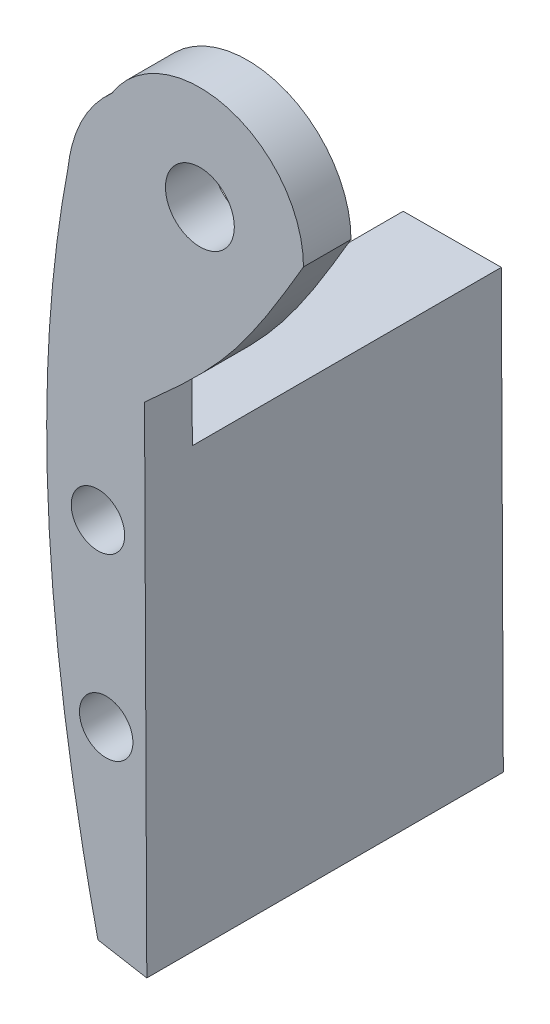
ISO-10303-21;
HEADER;
FILE_DESCRIPTION(('STEP AP214'),'2;1');
FILE_NAME('part.step','',(''),(''),'','','');
FILE_SCHEMA(('AUTOMOTIVE_DESIGN { 1 0 10303 214 1 1 1 1 }'));
ENDSEC;
DATA;
#1=APPLICATION_CONTEXT('core data for automotive mechanical design processes');
#2=APPLICATION_PROTOCOL_DEFINITION('international standard','automotive_design',2000,#1);
#3=PRODUCT_CONTEXT('',#1,'mechanical');
#4=PRODUCT('Part','Part','',(#3));
#5=PRODUCT_RELATED_PRODUCT_CATEGORY('part','',(#4));
#6=PRODUCT_DEFINITION_FORMATION('','',#4);
#7=PRODUCT_DEFINITION_CONTEXT('part definition',#1,'design');
#8=PRODUCT_DEFINITION('design','',#6,#7);
#9=PRODUCT_DEFINITION_SHAPE('','',#8);
#10=(LENGTH_UNIT() NAMED_UNIT(*) SI_UNIT(.MILLI.,.METRE.));
#11=(NAMED_UNIT(*) PLANE_ANGLE_UNIT() SI_UNIT($,.RADIAN.));
#12=(NAMED_UNIT(*) SI_UNIT($,.STERADIAN.) SOLID_ANGLE_UNIT());
#13=UNCERTAINTY_MEASURE_WITH_UNIT(LENGTH_MEASURE(1.E-05),#10,'distance_accuracy_value','');
#14=(GEOMETRIC_REPRESENTATION_CONTEXT(3) GLOBAL_UNCERTAINTY_ASSIGNED_CONTEXT((#13)) GLOBAL_UNIT_ASSIGNED_CONTEXT((#10,
#11,#12)) REPRESENTATION_CONTEXT('',''));
#15=CARTESIAN_POINT('',(0.,0.,0.));
#16=DIRECTION('',(0.,0.,1.));
#17=DIRECTION('',(1.,0.,0.));
#18=AXIS2_PLACEMENT_3D('',#15,#16,#17);
#19=CARTESIAN_POINT('',(-16.6639162338456,-14.6308064254302,-4.));
#20=CARTESIAN_POINT('',(-17.667702323107,-19.8812510451323,-4.));
#21=CARTESIAN_POINT('',(-18.2201315631726,-25.1890374929657,-4.));
#22=CARTESIAN_POINT('',(-18.4013115985762,-30.5145625315888,-4.));
#23=B_SPLINE_CURVE_WITH_KNOTS('',3,(#19,#20,#21,#22),.UNSPECIFIED.,.F.,.F.,(4,4),(0.,
0.288118642181765),.UNSPECIFIED.);
#24=DIRECTION('',(0.,0.,1.));
#25=VECTOR('',#24,1.);
#26=SURFACE_OF_LINEAR_EXTRUSION('',#23,#25);
#27=CARTESIAN_POINT('',(-18.4013115985762,-30.5145625315888,0.));
#28=CARTESIAN_POINT('',(-18.2201315631726,-25.1890374929657,0.));
#29=CARTESIAN_POINT('',(-17.667702323107,-19.8812510451323,0.));
#30=CARTESIAN_POINT('',(-16.6639162338456,-14.6308064254302,0.));
#31=B_SPLINE_CURVE_WITH_KNOTS('',3,(#27,#28,#29,#30),.UNSPECIFIED.,.F.,.F.,(4,4),(0.,
0.288118642181765),.UNSPECIFIED.);
#32=CARTESIAN_POINT('',(-16.6639162338456,-14.6308064254302,0.));
#33=VERTEX_POINT('',#32);
#34=CARTESIAN_POINT('',(-18.4013115985762,-30.5145625315887,0.));
#35=VERTEX_POINT('',#34);
#36=EDGE_CURVE('E181',#33,#35,#31,.F.);
#37=ORIENTED_EDGE('',*,*,#36,.F.);
#38=DIRECTION('',(0.,0.,1.));
#39=VECTOR('',#38,1.);
#40=CARTESIAN_POINT('',(-16.6639162338456,-14.6308064254302,-4.));
#41=LINE('',#40,#39);
#42=CARTESIAN_POINT('',(-16.6639162338456,-14.6308064254302,-4.));
#43=VERTEX_POINT('',#42);
#44=EDGE_CURVE('E11',#43,#33,#41,.T.);
#45=ORIENTED_EDGE('',*,*,#44,.F.);
#46=CARTESIAN_POINT('',(-16.6639162338456,-14.6308064254302,-4.));
#47=CARTESIAN_POINT('',(-17.667702323107,-19.8812510451323,-4.));
#48=CARTESIAN_POINT('',(-18.2201315631726,-25.1890374929657,-4.));
#49=CARTESIAN_POINT('',(-18.4013115985762,-30.5145625315888,-4.));
#50=B_SPLINE_CURVE_WITH_KNOTS('',3,(#46,#47,#48,#49),.UNSPECIFIED.,.F.,.F.,(4,4),(0.,
0.288118642181765),.UNSPECIFIED.);
#51=CARTESIAN_POINT('',(-18.4013115985762,-30.5145625315887,-4.));
#52=VERTEX_POINT('',#51);
#53=EDGE_CURVE('E173',#43,#52,#50,.T.);
#54=ORIENTED_EDGE('',*,*,#53,.T.);
#55=DIRECTION('',(0.,0.,1.));
#56=VECTOR('',#55,1.);
#57=CARTESIAN_POINT('',(-18.4013115985762,-30.5145625315887,-4.));
#58=LINE('',#57,#56);
#59=EDGE_CURVE('E101',#52,#35,#58,.T.);
#60=ORIENTED_EDGE('',*,*,#59,.T.);
#61=EDGE_LOOP('',(#37,#45,#54,#60));
#62=FACE_BOUND('',#61,.T.);
#63=ADVANCED_FACE('F41',(#62),#26,.T.);
#64=CARTESIAN_POINT('',(-12.9861837221063,-7.40648895480318,-4.));
#65=CARTESIAN_POINT('',(-16.1577958352121,-10.2367637695111,-4.));
#66=CARTESIAN_POINT('',(-16.6639162338456,-14.6308064254302,-4.));
#67=B_SPLINE_CURVE_WITH_KNOTS('',2,(#64,#65,#66),.UNSPECIFIED.,.F.,.F.,(3,3),(0.,1.),.UNSPECIFIED.);
#68=DIRECTION('',(0.,0.,1.));
#69=VECTOR('',#68,1.);
#70=SURFACE_OF_LINEAR_EXTRUSION('',#67,#69);
#71=CARTESIAN_POINT('',(-12.9861837221063,-7.40648895480318,0.));
#72=CARTESIAN_POINT('',(-16.1577958352121,-10.2367637695111,0.));
#73=CARTESIAN_POINT('',(-16.6639162338456,-14.6308064254302,0.));
#74=B_SPLINE_CURVE_WITH_KNOTS('',2,(#71,#72,#73),.UNSPECIFIED.,.F.,.F.,(3,3),(0.,1.),.UNSPECIFIED.);
#75=CARTESIAN_POINT('',(-12.9861837221063,-7.40648895480318,0.));
#76=VERTEX_POINT('',#75);
#77=EDGE_CURVE('E295',#76,#33,#74,.T.);
#78=ORIENTED_EDGE('',*,*,#77,.F.);
#79=DIRECTION('',(0.,0.,1.));
#80=VECTOR('',#79,1.);
#81=CARTESIAN_POINT('',(-12.9861837221063,-7.40648895480318,-4.));
#82=LINE('',#81,#80);
#83=CARTESIAN_POINT('',(-12.9861837221063,-7.40648895480318,-4.));
#84=VERTEX_POINT('',#83);
#85=EDGE_CURVE('E51',#84,#76,#82,.T.);
#86=ORIENTED_EDGE('',*,*,#85,.F.);
#87=EDGE_CURVE('E128',#84,#43,#67,.T.);
#88=ORIENTED_EDGE('',*,*,#87,.T.);
#89=ORIENTED_EDGE('',*,*,#44,.T.);
#90=EDGE_LOOP('',(#78,#86,#88,#89));
#91=FACE_BOUND('',#90,.T.);
#92=ADVANCED_FACE('F200',(#91),#70,.T.);
#93=CARTESIAN_POINT('',(-5.57162803204002,-11.9999999999996,-4.));
#94=DIRECTION('',(0.,0.,1.));
#95=DIRECTION('',(1.,0.,0.));
#96=AXIS2_PLACEMENT_3D('',#93,#94,#95);
#97=CYLINDRICAL_SURFACE('',#96,8.722154539071);
#98=CARTESIAN_POINT('',(-5.57162803204002,-11.9999999999996,0.));
#99=DIRECTION('',(0.,0.,1.));
#100=DIRECTION('',(1.,0.,0.));
#101=AXIS2_PLACEMENT_3D('',#98,#99,#100);
#102=CIRCLE('',#101,8.722154539071);
#103=CARTESIAN_POINT('',(3.15052650703097,-11.9999999999996,0.));
#104=VERTEX_POINT('',#103);
#105=EDGE_CURVE('E117',#104,#76,#102,.T.);
#106=ORIENTED_EDGE('',*,*,#105,.F.);
#107=DIRECTION('',(0.,0.,1.));
#108=VECTOR('',#107,1.);
#109=CARTESIAN_POINT('',(3.15052650703097,-11.9999999999996,-4.));
#110=LINE('',#109,#108);
#111=CARTESIAN_POINT('',(3.15052650703097,-11.9999999999996,-4.));
#112=VERTEX_POINT('',#111);
#113=EDGE_CURVE('E111',#112,#104,#110,.T.);
#114=ORIENTED_EDGE('',*,*,#113,.F.);
#115=CARTESIAN_POINT('',(-5.57162803204002,-11.9999999999996,-4.));
#116=DIRECTION('',(0.,0.,1.));
#117=DIRECTION('',(1.,0.,0.));
#118=AXIS2_PLACEMENT_3D('',#115,#116,#117);
#119=CIRCLE('',#118,8.722154539071);
#120=EDGE_CURVE('E114',#112,#84,#119,.T.);
#121=ORIENTED_EDGE('',*,*,#120,.T.);
#122=ORIENTED_EDGE('',*,*,#85,.T.);
#123=EDGE_LOOP('',(#106,#114,#121,#122));
#124=FACE_BOUND('',#123,.T.);
#125=ADVANCED_FACE('F113',(#124),#97,.T.);
#126=CARTESIAN_POINT('',(-10.2316008179203,-28.548135162408,-4.));
#127=CARTESIAN_POINT('',(-7.86437332426008,-26.4272964203006,-4.));
#128=CARTESIAN_POINT('',(-2.52235469825568,-21.6412925007652,-4.));
#129=CARTESIAN_POINT('',(1.12142674466251,-15.4485376326927,-4.));
#130=CARTESIAN_POINT('',(3.15052650703097,-11.9999999999996,-4.));
#131=B_SPLINE_CURVE_WITH_KNOTS('',3,(#126,#127,#128,#129,#130),.UNSPECIFIED.,.F.,.F.,(4,1,4),
(0.,0.443133515509802,1.),.UNSPECIFIED.);
#132=DIRECTION('',(0.,0.,1.));
#133=VECTOR('',#132,1.);
#134=SURFACE_OF_LINEAR_EXTRUSION('',#131,#133);
#135=CARTESIAN_POINT('',(-10.2316008179203,-28.548135162408,0.));
#136=CARTESIAN_POINT('',(-7.86437332426008,-26.4272964203006,0.));
#137=CARTESIAN_POINT('',(-2.52235469825568,-21.6412925007652,0.));
#138=CARTESIAN_POINT('',(1.12142674466251,-15.4485376326927,0.));
#139=CARTESIAN_POINT('',(3.15052650703097,-11.9999999999996,0.));
#140=B_SPLINE_CURVE_WITH_KNOTS('',3,(#135,#136,#137,#138,#139),.UNSPECIFIED.,.F.,.F.,(4,1,4),
(0.,0.443133515509802,1.),.UNSPECIFIED.);
#141=CARTESIAN_POINT('',(-10.2316008179203,-28.548135162408,0.));
#142=VERTEX_POINT('',#141);
#143=EDGE_CURVE('E297',#142,#104,#140,.T.);
#144=ORIENTED_EDGE('',*,*,#143,.F.);
#145=DIRECTION('',(0.,0.,1.));
#146=VECTOR('',#145,1.);
#147=CARTESIAN_POINT('',(-10.2316008179203,-28.548135162408,-4.));
#148=LINE('',#147,#146);
#149=CARTESIAN_POINT('',(-10.2316008179203,-28.548135162408,-4.));
#150=VERTEX_POINT('',#149);
#151=EDGE_CURVE('E122',#150,#142,#148,.T.);
#152=ORIENTED_EDGE('',*,*,#151,.F.);
#153=EDGE_CURVE('E127',#150,#112,#131,.T.);
#154=ORIENTED_EDGE('',*,*,#153,.T.);
#155=ORIENTED_EDGE('',*,*,#113,.T.);
#156=EDGE_LOOP('',(#144,#152,#154,#155));
#157=FACE_BOUND('',#156,.T.);
#158=ADVANCED_FACE('F131',(#157),#134,.T.);
#159=CARTESIAN_POINT('',(-10.0398414787974,-70.4384276849433,-4.));
#160=DIRECTION('',(0.999989522698505,0.00457760780494255,0.));
#161=DIRECTION('',(-0.00457760780494255,0.999989522698505,0.));
#162=AXIS2_PLACEMENT_3D('',#159,#160,#161);
#163=PLANE('',#162);
#164=DIRECTION('',(-0.00457760780494255,0.999989522698505,0.));
#165=VECTOR('',#164,1.);
#166=CARTESIAN_POINT('',(-10.0398414787974,-70.4384276849433,0.));
#167=LINE('',#166,#165);
#168=CARTESIAN_POINT('',(-10.0398414787974,-70.4384276849433,0.));
#169=VERTEX_POINT('',#168);
#170=EDGE_CURVE('E309',#169,#142,#167,.T.);
#171=ORIENTED_EDGE('',*,*,#170,.F.);
#172=DIRECTION('',(0.,0.,1.));
#173=VECTOR('',#172,1.);
#174=CARTESIAN_POINT('',(-10.0398414787974,-70.4384276849433,-4.));
#175=LINE('',#174,#173);
#176=CARTESIAN_POINT('',(-10.0398414787974,-70.4384276849433,-30.012432));
#177=VERTEX_POINT('',#176);
#178=EDGE_CURVE('E216',#177,#169,#175,.T.);
#179=ORIENTED_EDGE('',*,*,#178,.F.);
#180=DIRECTION('',(0.00457760780494154,-0.999989522698505,0.));
#181=VECTOR('',#180,1.);
#182=CARTESIAN_POINT('',(-10.2079392060906,-33.7170716305494,-30.012432));
#183=LINE('',#182,#181);
#184=CARTESIAN_POINT('',(-10.2079392060906,-33.7170716305494,-30.012432));
#185=VERTEX_POINT('',#184);
#186=EDGE_CURVE('E253',#185,#177,#183,.T.);
#187=ORIENTED_EDGE('',*,*,#186,.F.);
#188=DIRECTION('',(0.,0.,1.));
#189=VECTOR('',#188,1.);
#190=CARTESIAN_POINT('',(-10.2079392060906,-33.7170716305494,-30.012432));
#191=LINE('',#190,#189);
#192=CARTESIAN_POINT('',(-10.2079392060906,-33.7170716305494,-4.));
#193=VERTEX_POINT('',#192);
#194=EDGE_CURVE('E251',#185,#193,#191,.T.);
#195=ORIENTED_EDGE('',*,*,#194,.T.);
#196=DIRECTION('',(-0.00457760780494255,0.999989522698505,0.));
#197=VECTOR('',#196,1.);
#198=CARTESIAN_POINT('',(-10.0398414787974,-70.4384276849433,-4.));
#199=LINE('',#198,#197);
#200=EDGE_CURVE('E132',#193,#150,#199,.T.);
#201=ORIENTED_EDGE('',*,*,#200,.T.);
#202=ORIENTED_EDGE('',*,*,#151,.T.);
#203=EDGE_LOOP('',(#171,#179,#187,#195,#201,#202));
#204=FACE_BOUND('',#203,.T.);
#205=ADVANCED_FACE('F148',(#204),#163,.T.);
#206=CARTESIAN_POINT('',(-14.1533851889596,-69.7168711338995,-4.));
#207=DIRECTION('',(-0.172772117417386,-0.98496182435824,0.));
#208=DIRECTION('',(0.98496182435824,-0.172772117417386,0.));
#209=AXIS2_PLACEMENT_3D('',#206,#207,#208);
#210=PLANE('',#209);
#211=DIRECTION('',(0.98496182435824,-0.172772117417386,0.));
#212=VECTOR('',#211,1.);
#213=CARTESIAN_POINT('',(-14.1533851889596,-69.7168711338995,0.));
#214=LINE('',#213,#212);
#215=CARTESIAN_POINT('',(-14.1533851889596,-69.7168711338994,0.));
#216=VERTEX_POINT('',#215);
#217=EDGE_CURVE('E206',#216,#169,#214,.T.);
#218=ORIENTED_EDGE('',*,*,#217,.F.);
#219=DIRECTION('',(0.,0.,1.));
#220=VECTOR('',#219,1.);
#221=CARTESIAN_POINT('',(-14.1533851889596,-69.7168711338994,-4.));
#222=LINE('',#221,#220);
#223=CARTESIAN_POINT('',(-14.1533851889596,-69.7168711338994,-30.012432));
#224=VERTEX_POINT('',#223);
#225=EDGE_CURVE('E215',#224,#216,#222,.T.);
#226=ORIENTED_EDGE('',*,*,#225,.F.);
#227=DIRECTION('',(-0.984961824358234,0.172772117417422,0.));
#228=VECTOR('',#227,1.);
#229=CARTESIAN_POINT('',(-10.0398414787974,-70.4384276849433,-30.012432));
#230=LINE('',#229,#228);
#231=EDGE_CURVE('E250',#177,#224,#230,.T.);
#232=ORIENTED_EDGE('',*,*,#231,.F.);
#233=ORIENTED_EDGE('',*,*,#178,.T.);
#234=EDGE_LOOP('',(#218,#226,#232,#233));
#235=FACE_BOUND('',#234,.T.);
#236=ADVANCED_FACE('F152',(#235),#210,.T.);
#237=CARTESIAN_POINT('',(-18.4013115985762,-30.5145625315887,-4.));
#238=CARTESIAN_POINT('',(-18.8489698571187,-43.6728294416428,-4.));
#239=CARTESIAN_POINT('',(-17.030220330295,-56.9393871702691,-4.));
#240=CARTESIAN_POINT('',(-14.1533851889596,-69.7168711338994,-4.));
#241=B_SPLINE_CURVE_WITH_KNOTS('',3,(#237,#238,#239,#240),.UNSPECIFIED.,.F.,.F.,(4,4),
(0.288118642181765,1.),.UNSPECIFIED.);
#242=DIRECTION('',(0.,0.,1.));
#243=VECTOR('',#242,1.);
#244=SURFACE_OF_LINEAR_EXTRUSION('',#241,#243);
#245=CARTESIAN_POINT('',(-18.4013115985762,-30.5145625315887,0.));
#246=CARTESIAN_POINT('',(-18.8489698571187,-43.6728294416428,0.));
#247=CARTESIAN_POINT('',(-17.030220330295,-56.9393871702691,0.));
#248=CARTESIAN_POINT('',(-14.1533851889596,-69.7168711338994,0.));
#249=B_SPLINE_CURVE_WITH_KNOTS('',3,(#245,#246,#247,#248),.UNSPECIFIED.,.F.,.F.,(4,4),
(0.288118642181765,1.),.UNSPECIFIED.);
#250=EDGE_CURVE('E294',#35,#216,#249,.T.);
#251=ORIENTED_EDGE('',*,*,#250,.F.);
#252=ORIENTED_EDGE('',*,*,#59,.F.);
#253=CARTESIAN_POINT('',(-18.4663935069069,-33.7548759910607,-4.));
#254=VERTEX_POINT('',#253);
#255=EDGE_CURVE('E134',#52,#254,#241,.T.);
#256=ORIENTED_EDGE('',*,*,#255,.T.);
#257=DIRECTION('',(0.,0.,1.));
#258=VECTOR('',#257,1.);
#259=CARTESIAN_POINT('',(-18.4663935069097,-33.7548759915013,-17.006216));
#260=LINE('',#259,#258);
#261=CARTESIAN_POINT('',(-18.4663935069097,-33.7548759915013,-30.012432));
#262=VERTEX_POINT('',#261);
#263=EDGE_CURVE('E242',#262,#254,#260,.T.);
#264=ORIENTED_EDGE('',*,*,#263,.F.);
#265=CARTESIAN_POINT('',(-18.4663935069097,-33.7548759915013,-30.012432));
#266=CARTESIAN_POINT('',(-18.5434333171569,-45.8462770612342,-30.012432));
#267=CARTESIAN_POINT('',(-16.7942088460879,-57.9876338742109,-30.012432));
#268=CARTESIAN_POINT('',(-14.1533851889596,-69.7168711338994,-30.012432));
#269=B_SPLINE_CURVE_WITH_KNOTS('',3,(#265,#266,#267,#268),.UNSPECIFIED.,.F.,.F.,(4,4),
(0.346520381448641,1.),.UNSPECIFIED.);
#270=EDGE_CURVE('E233',#224,#262,#269,.F.);
#271=ORIENTED_EDGE('',*,*,#270,.F.);
#272=ORIENTED_EDGE('',*,*,#225,.T.);
#273=EDGE_LOOP('',(#251,#252,#256,#264,#271,#272));
#274=FACE_BOUND('',#273,.T.);
#275=ADVANCED_FACE('F155',(#274),#244,.T.);
#276=CARTESIAN_POINT('',(-17.8410911864076,-22.5445293214141,-4.));
#277=DIRECTION('',(0.,0.,-1.));
#278=DIRECTION('',(-1.,0.,0.));
#279=AXIS2_PLACEMENT_3D('',#276,#277,#278);
#280=PLANE('',#279);
#281=DIRECTION('',(0.999989522698505,0.00457760780494379,0.));
#282=VECTOR('',#281,1.);
#283=CARTESIAN_POINT('',(-10.2079392060906,-33.7170716305494,-4.));
#284=LINE('',#283,#282);
#285=EDGE_CURVE('E59',#254,#193,#284,.T.);
#286=ORIENTED_EDGE('',*,*,#285,.F.);
#287=ORIENTED_EDGE('',*,*,#255,.F.);
#288=ORIENTED_EDGE('',*,*,#53,.F.);
#289=ORIENTED_EDGE('',*,*,#87,.F.);
#290=ORIENTED_EDGE('',*,*,#120,.F.);
#291=ORIENTED_EDGE('',*,*,#153,.F.);
#292=ORIENTED_EDGE('',*,*,#200,.F.);
#293=EDGE_LOOP('',(#286,#287,#288,#289,#290,#291,#292));
#294=FACE_BOUND('',#293,.T.);
#295=CARTESIAN_POINT('',(-5.57162803204002,-11.9999999999996,-4.));
#296=DIRECTION('',(0.,0.,1.));
#297=DIRECTION('',(1.,0.,0.));
#298=AXIS2_PLACEMENT_3D('',#295,#296,#297);
#299=CIRCLE('',#298,2.9);
#300=CARTESIAN_POINT('',(-2.67162803204002,-11.9999999999996,-4.));
#301=VERTEX_POINT('',#300);
#302=EDGE_CURVE('E275',#301,#301,#299,.T.);
#303=ORIENTED_EDGE('',*,*,#302,.T.);
#304=EDGE_LOOP('',(#303));
#305=FACE_BOUND('',#304,.T.);
#306=ADVANCED_FACE('F125',(#294,#305),#280,.T.);
#307=CARTESIAN_POINT('',(-17.8410911864076,-22.5445293214141,0.));
#308=DIRECTION('',(0.,0.,-1.));
#309=DIRECTION('',(-1.,0.,0.));
#310=AXIS2_PLACEMENT_3D('',#307,#308,#309);
#311=PLANE('',#310);
#312=CARTESIAN_POINT('',(-13.4596618619648,-53.8503120663386,0.));
#313=DIRECTION('',(0.,0.,1.));
#314=DIRECTION('',(1.,0.,0.));
#315=AXIS2_PLACEMENT_3D('',#312,#313,#314);
#316=CIRCLE('',#315,2.25);
#317=CARTESIAN_POINT('',(-11.2096618619648,-53.8503120663386,0.));
#318=VERTEX_POINT('',#317);
#319=EDGE_CURVE('E355',#318,#318,#316,.T.);
#320=ORIENTED_EDGE('',*,*,#319,.F.);
#321=EDGE_LOOP('',(#320));
#322=FACE_BOUND('',#321,.T.);
#323=CARTESIAN_POINT('',(-14.1521539456759,-39.1038161764318,0.));
#324=DIRECTION('',(0.,0.,1.));
#325=DIRECTION('',(1.,0.,0.));
#326=AXIS2_PLACEMENT_3D('',#323,#324,#325);
#327=CIRCLE('',#326,2.25);
#328=CARTESIAN_POINT('',(-11.9021539456759,-39.1038161764318,0.));
#329=VERTEX_POINT('',#328);
#330=EDGE_CURVE('E352',#329,#329,#327,.T.);
#331=ORIENTED_EDGE('',*,*,#330,.F.);
#332=EDGE_LOOP('',(#331));
#333=FACE_BOUND('',#332,.T.);
#334=CARTESIAN_POINT('',(-5.57162803204002,-11.9999999999996,0.));
#335=DIRECTION('',(0.,0.,1.));
#336=DIRECTION('',(1.,0.,0.));
#337=AXIS2_PLACEMENT_3D('',#334,#335,#336);
#338=CIRCLE('',#337,2.9);
#339=CARTESIAN_POINT('',(-2.67162803204002,-11.9999999999996,0.));
#340=VERTEX_POINT('',#339);
#341=EDGE_CURVE('E266',#340,#340,#338,.T.);
#342=ORIENTED_EDGE('',*,*,#341,.F.);
#343=EDGE_LOOP('',(#342));
#344=FACE_BOUND('',#343,.T.);
#345=ORIENTED_EDGE('',*,*,#36,.T.);
#346=ORIENTED_EDGE('',*,*,#250,.T.);
#347=ORIENTED_EDGE('',*,*,#217,.T.);
#348=ORIENTED_EDGE('',*,*,#170,.T.);
#349=ORIENTED_EDGE('',*,*,#143,.T.);
#350=ORIENTED_EDGE('',*,*,#105,.T.);
#351=ORIENTED_EDGE('',*,*,#77,.T.);
#352=EDGE_LOOP('',(#345,#346,#347,#348,#349,#350,#351));
#353=FACE_BOUND('',#352,.T.);
#354=ADVANCED_FACE('F187',(#322,#333,#344,#353),#311,.F.);
#355=CARTESIAN_POINT('',(-5.57162803204002,-11.9999999999996,-4.));
#356=DIRECTION('',(0.,0.,1.));
#357=DIRECTION('',(1.,0.,0.));
#358=AXIS2_PLACEMENT_3D('',#355,#356,#357);
#359=CYLINDRICAL_SURFACE('',#358,2.9);
#360=ORIENTED_EDGE('',*,*,#302,.F.);
#361=EDGE_LOOP('',(#360));
#362=FACE_BOUND('',#361,.T.);
#363=ORIENTED_EDGE('',*,*,#341,.T.);
#364=EDGE_LOOP('',(#363));
#365=FACE_BOUND('',#364,.T.);
#366=ADVANCED_FACE('F196',(#362,#365),#359,.F.);
#367=CARTESIAN_POINT('',(-17.3290881482005,-51.8716849914672,-30.012432));
#368=DIRECTION('',(0.,0.,1.));
#369=DIRECTION('',(1.,0.,0.));
#370=AXIS2_PLACEMENT_3D('',#367,#368,#369);
#371=PLANE('',#370);
#372=CARTESIAN_POINT('',(-13.4596618619648,-53.8503120663386,-30.012432));
#373=DIRECTION('',(0.,0.,1.));
#374=DIRECTION('',(1.,0.,0.));
#375=AXIS2_PLACEMENT_3D('',#372,#373,#374);
#376=CIRCLE('',#375,2.25);
#377=CARTESIAN_POINT('',(-11.2096618619648,-53.8503120663386,-30.012432));
#378=VERTEX_POINT('',#377);
#379=EDGE_CURVE('E46',#378,#378,#376,.T.);
#380=ORIENTED_EDGE('',*,*,#379,.T.);
#381=EDGE_LOOP('',(#380));
#382=FACE_BOUND('',#381,.T.);
#383=ORIENTED_EDGE('',*,*,#186,.T.);
#384=ORIENTED_EDGE('',*,*,#231,.T.);
#385=ORIENTED_EDGE('',*,*,#270,.T.);
#386=DIRECTION('',(0.999989522698505,0.00457760780494379,0.));
#387=VECTOR('',#386,1.);
#388=CARTESIAN_POINT('',(-10.2079392060906,-33.7170716305494,-30.012432));
#389=LINE('',#388,#387);
#390=EDGE_CURVE('E249',#262,#185,#389,.T.);
#391=ORIENTED_EDGE('',*,*,#390,.T.);
#392=EDGE_LOOP('',(#383,#384,#385,#391));
#393=FACE_BOUND('',#392,.T.);
#394=CARTESIAN_POINT('',(-14.1521539456759,-39.1038161764318,-30.012432));
#395=DIRECTION('',(0.,0.,-1.));
#396=DIRECTION('',(-1.,0.,0.));
#397=AXIS2_PLACEMENT_3D('',#394,#395,#396);
#398=CIRCLE('',#397,2.25);
#399=CARTESIAN_POINT('',(-16.4021539456759,-39.1038161764318,-30.012432));
#400=VERTEX_POINT('',#399);
#401=EDGE_CURVE('E272',#400,#400,#398,.T.);
#402=ORIENTED_EDGE('',*,*,#401,.F.);
#403=EDGE_LOOP('',(#402));
#404=FACE_BOUND('',#403,.T.);
#405=ADVANCED_FACE('F282',(#382,#393,#404),#371,.F.);
#406=CARTESIAN_POINT('',(-10.2079392060906,-33.7170716305494,-30.012432));
#407=DIRECTION('',(0.00457760780494379,-0.999989522698505,0.));
#408=DIRECTION('',(0.999989522698505,0.00457760780494379,0.));
#409=AXIS2_PLACEMENT_3D('',#406,#407,#408);
#410=PLANE('',#409);
#411=ORIENTED_EDGE('',*,*,#285,.T.);
#412=ORIENTED_EDGE('',*,*,#194,.F.);
#413=ORIENTED_EDGE('',*,*,#390,.F.);
#414=ORIENTED_EDGE('',*,*,#263,.T.);
#415=EDGE_LOOP('',(#411,#412,#413,#414));
#416=FACE_BOUND('',#415,.T.);
#417=ADVANCED_FACE('F287',(#416),#410,.F.);
#418=CARTESIAN_POINT('',(-14.1521539456759,-39.1038161764318,-30.012432));
#419=DIRECTION('',(0.,0.,1.));
#420=DIRECTION('',(1.,0.,0.));
#421=AXIS2_PLACEMENT_3D('',#418,#419,#420);
#422=CYLINDRICAL_SURFACE('',#421,2.25);
#423=ORIENTED_EDGE('',*,*,#401,.T.);
#424=EDGE_LOOP('',(#423));
#425=FACE_BOUND('',#424,.T.);
#426=ORIENTED_EDGE('',*,*,#330,.T.);
#427=EDGE_LOOP('',(#426));
#428=FACE_BOUND('',#427,.T.);
#429=ADVANCED_FACE('F364',(#425,#428),#422,.F.);
#430=CARTESIAN_POINT('',(-13.4596618619648,-53.8503120663386,-30.012932));
#431=DIRECTION('',(0.,0.,1.));
#432=DIRECTION('',(1.,0.,0.));
#433=AXIS2_PLACEMENT_3D('',#430,#431,#432);
#434=CYLINDRICAL_SURFACE('',#433,2.25);
#435=ORIENTED_EDGE('',*,*,#319,.T.);
#436=EDGE_LOOP('',(#435));
#437=FACE_BOUND('',#436,.T.);
#438=ORIENTED_EDGE('',*,*,#379,.F.);
#439=EDGE_LOOP('',(#438));
#440=FACE_BOUND('',#439,.T.);
#441=ADVANCED_FACE('F362',(#437,#440),#434,.F.);
#442=CLOSED_SHELL('',(#63,#92,#125,#158,#205,#236,#275,#306,#354,#366,#405,#417,#429,#441));
#443=MANIFOLD_SOLID_BREP('B2',#442);
#444=ADVANCED_BREP_SHAPE_REPRESENTATION('',(#18,#443),#14);
#445=SHAPE_DEFINITION_REPRESENTATION(#9,#444);
ENDSEC;
END-ISO-10303-21;
